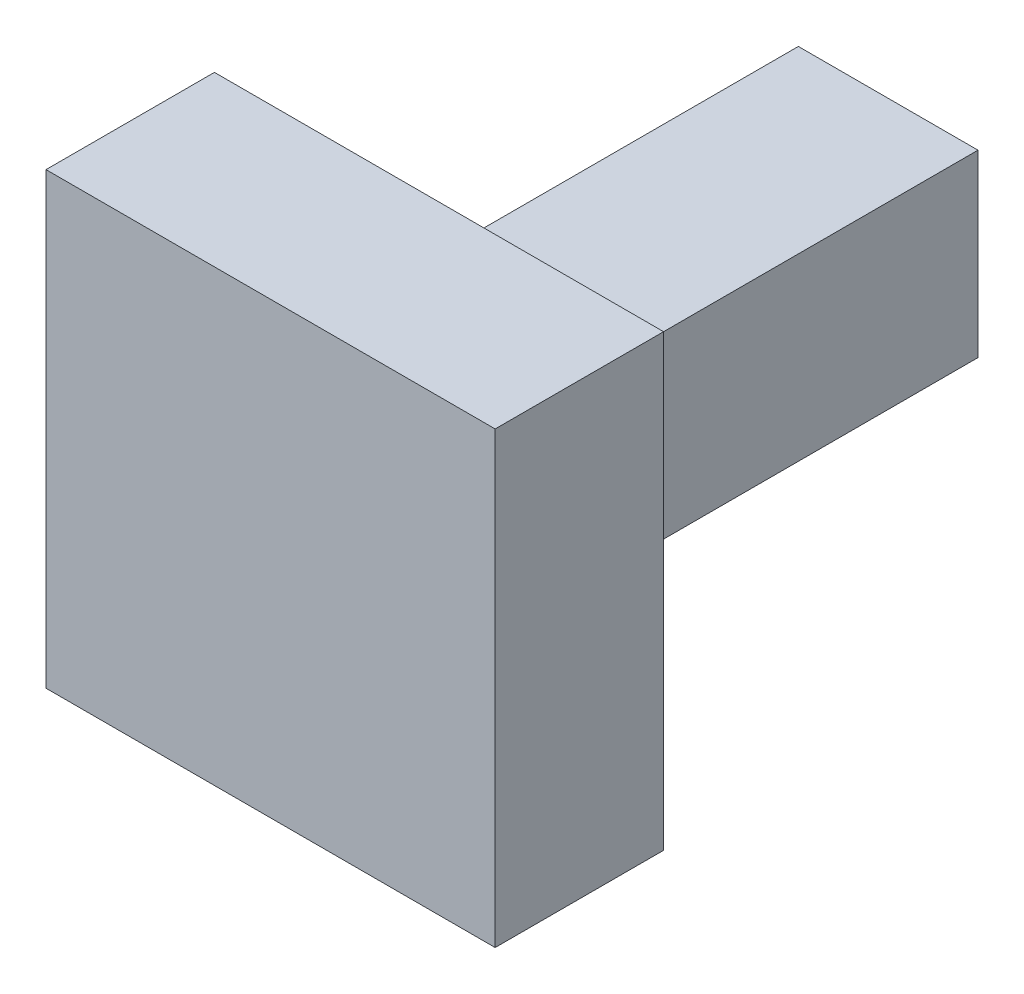
ISO-10303-21;
HEADER;
FILE_DESCRIPTION(('STEP AP214'),'2;1');
FILE_NAME('part.step','',(''),(''),'','','');
FILE_SCHEMA(('AUTOMOTIVE_DESIGN { 1 0 10303 214 1 1 1 1 }'));
ENDSEC;
DATA;
#1=APPLICATION_CONTEXT('core data for automotive mechanical design processes');
#2=APPLICATION_PROTOCOL_DEFINITION('international standard','automotive_design',2000,#1);
#3=PRODUCT_CONTEXT('',#1,'mechanical');
#4=PRODUCT('Part','Part','',(#3));
#5=PRODUCT_RELATED_PRODUCT_CATEGORY('part','',(#4));
#6=PRODUCT_DEFINITION_FORMATION('','',#4);
#7=PRODUCT_DEFINITION_CONTEXT('part definition',#1,'design');
#8=PRODUCT_DEFINITION('design','',#6,#7);
#9=PRODUCT_DEFINITION_SHAPE('','',#8);
#10=(LENGTH_UNIT() NAMED_UNIT(*) SI_UNIT(.MILLI.,.METRE.));
#11=(NAMED_UNIT(*) PLANE_ANGLE_UNIT() SI_UNIT($,.RADIAN.));
#12=(NAMED_UNIT(*) SI_UNIT($,.STERADIAN.) SOLID_ANGLE_UNIT());
#13=UNCERTAINTY_MEASURE_WITH_UNIT(LENGTH_MEASURE(1.E-05),#10,'distance_accuracy_value','');
#14=(GEOMETRIC_REPRESENTATION_CONTEXT(3) GLOBAL_UNCERTAINTY_ASSIGNED_CONTEXT((#13)) GLOBAL_UNIT_ASSIGNED_CONTEXT((#10,
#11,#12)) REPRESENTATION_CONTEXT('',''));
#15=CARTESIAN_POINT('',(0.,0.,0.));
#16=DIRECTION('',(0.,0.,1.));
#17=DIRECTION('',(1.,0.,0.));
#18=AXIS2_PLACEMENT_3D('',#15,#16,#17);
#19=CARTESIAN_POINT('',(0.,0.,15.));
#20=DIRECTION('',(0.,0.,1.));
#21=DIRECTION('',(1.,0.,0.));
#22=AXIS2_PLACEMENT_3D('',#19,#20,#21);
#23=PLANE('',#22);
#24=DIRECTION('',(0.,1.,0.));
#25=VECTOR('',#24,1.);
#26=CARTESIAN_POINT('',(20.,20.,15.));
#27=LINE('',#26,#25);
#28=CARTESIAN_POINT('',(20.,-20.,15.));
#29=VERTEX_POINT('',#28);
#30=CARTESIAN_POINT('',(20.,20.,15.));
#31=VERTEX_POINT('',#30);
#32=EDGE_CURVE('E171',#29,#31,#27,.T.);
#33=ORIENTED_EDGE('',*,*,#32,.T.);
#34=DIRECTION('',(-1.,0.,0.));
#35=VECTOR('',#34,1.);
#36=CARTESIAN_POINT('',(-20.,20.,15.));
#37=LINE('',#36,#35);
#38=CARTESIAN_POINT('',(-20.,20.,15.));
#39=VERTEX_POINT('',#38);
#40=EDGE_CURVE('E88',#31,#39,#37,.T.);
#41=ORIENTED_EDGE('',*,*,#40,.T.);
#42=DIRECTION('',(0.,-1.,0.));
#43=VECTOR('',#42,1.);
#44=CARTESIAN_POINT('',(-20.,20.,15.));
#45=LINE('',#44,#43);
#46=CARTESIAN_POINT('',(-20.,-20.,15.));
#47=VERTEX_POINT('',#46);
#48=EDGE_CURVE('E176',#39,#47,#45,.T.);
#49=ORIENTED_EDGE('',*,*,#48,.T.);
#50=DIRECTION('',(1.,0.,0.));
#51=VECTOR('',#50,1.);
#52=CARTESIAN_POINT('',(-20.,-20.,15.));
#53=LINE('',#52,#51);
#54=EDGE_CURVE('E57',#47,#29,#53,.T.);
#55=ORIENTED_EDGE('',*,*,#54,.T.);
#56=EDGE_LOOP('',(#33,#41,#49,#55));
#57=FACE_BOUND('',#56,.T.);
#58=ADVANCED_FACE('F39',(#57),#23,.T.);
#59=CARTESIAN_POINT('',(0.,0.,0.));
#60=DIRECTION('',(0.,0.,1.));
#61=DIRECTION('',(1.,0.,0.));
#62=AXIS2_PLACEMENT_3D('',#59,#60,#61);
#63=PLANE('',#62);
#64=DIRECTION('',(0.,1.,0.));
#65=VECTOR('',#64,1.);
#66=CARTESIAN_POINT('',(20.,20.,0.));
#67=LINE('',#66,#65);
#68=CARTESIAN_POINT('',(20.,-20.,0.));
#69=VERTEX_POINT('',#68);
#70=CARTESIAN_POINT('',(20.,20.,0.));
#71=VERTEX_POINT('',#70);
#72=EDGE_CURVE('E170',#69,#71,#67,.T.);
#73=ORIENTED_EDGE('',*,*,#72,.F.);
#74=DIRECTION('',(1.,0.,0.));
#75=VECTOR('',#74,1.);
#76=CARTESIAN_POINT('',(-20.,-20.,0.));
#77=LINE('',#76,#75);
#78=CARTESIAN_POINT('',(-20.,-20.,0.));
#79=VERTEX_POINT('',#78);
#80=EDGE_CURVE('E81',#79,#69,#77,.T.);
#81=ORIENTED_EDGE('',*,*,#80,.F.);
#82=DIRECTION('',(0.,-1.,0.));
#83=VECTOR('',#82,1.);
#84=CARTESIAN_POINT('',(-20.,20.,0.));
#85=LINE('',#84,#83);
#86=CARTESIAN_POINT('',(-20.,20.,0.));
#87=VERTEX_POINT('',#86);
#88=EDGE_CURVE('E75',#87,#79,#85,.T.);
#89=ORIENTED_EDGE('',*,*,#88,.F.);
#90=DIRECTION('',(-1.,0.,0.));
#91=VECTOR('',#90,1.);
#92=CARTESIAN_POINT('',(-20.,20.,0.));
#93=LINE('',#92,#91);
#94=EDGE_CURVE('E185',#71,#87,#93,.T.);
#95=ORIENTED_EDGE('',*,*,#94,.F.);
#96=EDGE_LOOP('',(#73,#81,#89,#95));
#97=FACE_BOUND('',#96,.T.);
#98=DIRECTION('',(0.,1.,0.));
#99=VECTOR('',#98,1.);
#100=CARTESIAN_POINT('',(8.,8.,0.));
#101=LINE('',#100,#99);
#102=CARTESIAN_POINT('',(8.,-8.,0.));
#103=VERTEX_POINT('',#102);
#104=CARTESIAN_POINT('',(8.,8.,0.));
#105=VERTEX_POINT('',#104);
#106=EDGE_CURVE('E151',#103,#105,#101,.T.);
#107=ORIENTED_EDGE('',*,*,#106,.T.);
#108=DIRECTION('',(-1.,0.,0.));
#109=VECTOR('',#108,1.);
#110=CARTESIAN_POINT('',(-8.,8.,0.));
#111=LINE('',#110,#109);
#112=CARTESIAN_POINT('',(-8.,8.,0.));
#113=VERTEX_POINT('',#112);
#114=EDGE_CURVE('E161',#105,#113,#111,.T.);
#115=ORIENTED_EDGE('',*,*,#114,.T.);
#116=DIRECTION('',(0.,-1.,0.));
#117=VECTOR('',#116,1.);
#118=CARTESIAN_POINT('',(-8.,8.,0.));
#119=LINE('',#118,#117);
#120=CARTESIAN_POINT('',(-8.,-8.,0.));
#121=VERTEX_POINT('',#120);
#122=EDGE_CURVE('E120',#113,#121,#119,.T.);
#123=ORIENTED_EDGE('',*,*,#122,.T.);
#124=DIRECTION('',(1.,0.,0.));
#125=VECTOR('',#124,1.);
#126=CARTESIAN_POINT('',(-8.,-8.,0.));
#127=LINE('',#126,#125);
#128=EDGE_CURVE('E166',#121,#103,#127,.T.);
#129=ORIENTED_EDGE('',*,*,#128,.T.);
#130=EDGE_LOOP('',(#107,#115,#123,#129));
#131=FACE_BOUND('',#130,.T.);
#132=ADVANCED_FACE('F201',(#97,#131),#63,.F.);
#133=CARTESIAN_POINT('',(20.,20.,15.));
#134=DIRECTION('',(-1.,0.,0.));
#135=DIRECTION('',(0.,0.,1.));
#136=AXIS2_PLACEMENT_3D('',#133,#134,#135);
#137=PLANE('',#136);
#138=ORIENTED_EDGE('',*,*,#72,.T.);
#139=DIRECTION('',(0.,0.,-1.));
#140=VECTOR('',#139,1.);
#141=CARTESIAN_POINT('',(20.,20.,15.));
#142=LINE('',#141,#140);
#143=EDGE_CURVE('E11',#31,#71,#142,.T.);
#144=ORIENTED_EDGE('',*,*,#143,.F.);
#145=ORIENTED_EDGE('',*,*,#32,.F.);
#146=DIRECTION('',(0.,0.,-1.));
#147=VECTOR('',#146,1.);
#148=CARTESIAN_POINT('',(20.,-20.,15.));
#149=LINE('',#148,#147);
#150=EDGE_CURVE('E181',#29,#69,#149,.T.);
#151=ORIENTED_EDGE('',*,*,#150,.T.);
#152=EDGE_LOOP('',(#138,#144,#145,#151));
#153=FACE_BOUND('',#152,.T.);
#154=ADVANCED_FACE('F41',(#153),#137,.F.);
#155=CARTESIAN_POINT('',(-20.,20.,15.));
#156=DIRECTION('',(0.,-1.,0.));
#157=DIRECTION('',(0.,0.,-1.));
#158=AXIS2_PLACEMENT_3D('',#155,#156,#157);
#159=PLANE('',#158);
#160=ORIENTED_EDGE('',*,*,#94,.T.);
#161=DIRECTION('',(0.,0.,-1.));
#162=VECTOR('',#161,1.);
#163=CARTESIAN_POINT('',(-20.,20.,15.));
#164=LINE('',#163,#162);
#165=EDGE_CURVE('E49',#39,#87,#164,.T.);
#166=ORIENTED_EDGE('',*,*,#165,.F.);
#167=ORIENTED_EDGE('',*,*,#40,.F.);
#168=ORIENTED_EDGE('',*,*,#143,.T.);
#169=EDGE_LOOP('',(#160,#166,#167,#168));
#170=FACE_BOUND('',#169,.T.);
#171=ADVANCED_FACE('F215',(#170),#159,.F.);
#172=CARTESIAN_POINT('',(-20.,20.,15.));
#173=DIRECTION('',(1.,0.,0.));
#174=DIRECTION('',(0.,1.,0.));
#175=AXIS2_PLACEMENT_3D('',#172,#173,#174);
#176=PLANE('',#175);
#177=ORIENTED_EDGE('',*,*,#88,.T.);
#178=DIRECTION('',(0.,0.,-1.));
#179=VECTOR('',#178,1.);
#180=CARTESIAN_POINT('',(-20.,-20.,15.));
#181=LINE('',#180,#179);
#182=EDGE_CURVE('E194',#47,#79,#181,.T.);
#183=ORIENTED_EDGE('',*,*,#182,.F.);
#184=ORIENTED_EDGE('',*,*,#48,.F.);
#185=ORIENTED_EDGE('',*,*,#165,.T.);
#186=EDGE_LOOP('',(#177,#183,#184,#185));
#187=FACE_BOUND('',#186,.T.);
#188=ADVANCED_FACE('F198',(#187),#176,.F.);
#189=CARTESIAN_POINT('',(-20.,-20.,15.));
#190=DIRECTION('',(0.,1.,0.));
#191=DIRECTION('',(0.,0.,1.));
#192=AXIS2_PLACEMENT_3D('',#189,#190,#191);
#193=PLANE('',#192);
#194=ORIENTED_EDGE('',*,*,#80,.T.);
#195=ORIENTED_EDGE('',*,*,#150,.F.);
#196=ORIENTED_EDGE('',*,*,#54,.F.);
#197=ORIENTED_EDGE('',*,*,#182,.T.);
#198=EDGE_LOOP('',(#194,#195,#196,#197));
#199=FACE_BOUND('',#198,.T.);
#200=ADVANCED_FACE('F206',(#199),#193,.F.);
#201=CARTESIAN_POINT('',(8.,8.,-40.));
#202=DIRECTION('',(0.,1.,0.));
#203=DIRECTION('',(0.,0.,1.));
#204=AXIS2_PLACEMENT_3D('',#201,#202,#203);
#205=PLANE('',#204);
#206=ORIENTED_EDGE('',*,*,#114,.F.);
#207=DIRECTION('',(0.,0.,1.));
#208=VECTOR('',#207,1.);
#209=CARTESIAN_POINT('',(8.,8.,-40.));
#210=LINE('',#209,#208);
#211=CARTESIAN_POINT('',(8.,8.,-40.));
#212=VERTEX_POINT('',#211);
#213=EDGE_CURVE('E141',#212,#105,#210,.T.);
#214=ORIENTED_EDGE('',*,*,#213,.F.);
#215=DIRECTION('',(-1.,0.,0.));
#216=VECTOR('',#215,1.);
#217=CARTESIAN_POINT('',(8.,8.,-40.));
#218=LINE('',#217,#216);
#219=CARTESIAN_POINT('',(-8.,8.,-40.));
#220=VERTEX_POINT('',#219);
#221=EDGE_CURVE('E133',#212,#220,#218,.T.);
#222=ORIENTED_EDGE('',*,*,#221,.T.);
#223=DIRECTION('',(0.,0.,1.));
#224=VECTOR('',#223,1.);
#225=CARTESIAN_POINT('',(-8.,8.,-40.));
#226=LINE('',#225,#224);
#227=EDGE_CURVE('E115',#220,#113,#226,.T.);
#228=ORIENTED_EDGE('',*,*,#227,.T.);
#229=EDGE_LOOP('',(#206,#214,#222,#228));
#230=FACE_BOUND('',#229,.T.);
#231=ADVANCED_FACE('F139',(#230),#205,.T.);
#232=CARTESIAN_POINT('',(-8.,-8.,-40.));
#233=DIRECTION('',(0.,-1.,0.));
#234=DIRECTION('',(0.,0.,-1.));
#235=AXIS2_PLACEMENT_3D('',#232,#233,#234);
#236=PLANE('',#235);
#237=ORIENTED_EDGE('',*,*,#128,.F.);
#238=DIRECTION('',(0.,0.,1.));
#239=VECTOR('',#238,1.);
#240=CARTESIAN_POINT('',(-8.,-8.,-40.));
#241=LINE('',#240,#239);
#242=CARTESIAN_POINT('',(-8.,-8.,-40.));
#243=VERTEX_POINT('',#242);
#244=EDGE_CURVE('E125',#243,#121,#241,.T.);
#245=ORIENTED_EDGE('',*,*,#244,.F.);
#246=DIRECTION('',(1.,0.,0.));
#247=VECTOR('',#246,1.);
#248=CARTESIAN_POINT('',(-8.,-8.,-40.));
#249=LINE('',#248,#247);
#250=CARTESIAN_POINT('',(8.,-8.,-40.));
#251=VERTEX_POINT('',#250);
#252=EDGE_CURVE('E136',#243,#251,#249,.T.);
#253=ORIENTED_EDGE('',*,*,#252,.T.);
#254=DIRECTION('',(0.,0.,1.));
#255=VECTOR('',#254,1.);
#256=CARTESIAN_POINT('',(8.,-8.,-40.));
#257=LINE('',#256,#255);
#258=EDGE_CURVE('E152',#251,#103,#257,.T.);
#259=ORIENTED_EDGE('',*,*,#258,.T.);
#260=EDGE_LOOP('',(#237,#245,#253,#259));
#261=FACE_BOUND('',#260,.T.);
#262=ADVANCED_FACE('F213',(#261),#236,.T.);
#263=CARTESIAN_POINT('',(8.,-8.,-40.));
#264=DIRECTION('',(1.,0.,0.));
#265=DIRECTION('',(0.,1.,0.));
#266=AXIS2_PLACEMENT_3D('',#263,#264,#265);
#267=PLANE('',#266);
#268=ORIENTED_EDGE('',*,*,#106,.F.);
#269=ORIENTED_EDGE('',*,*,#258,.F.);
#270=DIRECTION('',(0.,1.,0.));
#271=VECTOR('',#270,1.);
#272=CARTESIAN_POINT('',(8.,-8.,-40.));
#273=LINE('',#272,#271);
#274=EDGE_CURVE('E126',#251,#212,#273,.T.);
#275=ORIENTED_EDGE('',*,*,#274,.T.);
#276=ORIENTED_EDGE('',*,*,#213,.T.);
#277=EDGE_LOOP('',(#268,#269,#275,#276));
#278=FACE_BOUND('',#277,.T.);
#279=ADVANCED_FACE('F226',(#278),#267,.T.);
#280=CARTESIAN_POINT('',(-8.,8.,-40.));
#281=DIRECTION('',(-1.,0.,0.));
#282=DIRECTION('',(0.,-1.,0.));
#283=AXIS2_PLACEMENT_3D('',#280,#281,#282);
#284=PLANE('',#283);
#285=ORIENTED_EDGE('',*,*,#122,.F.);
#286=ORIENTED_EDGE('',*,*,#227,.F.);
#287=DIRECTION('',(0.,-1.,0.));
#288=VECTOR('',#287,1.);
#289=CARTESIAN_POINT('',(-8.,8.,-40.));
#290=LINE('',#289,#288);
#291=EDGE_CURVE('E118',#220,#243,#290,.T.);
#292=ORIENTED_EDGE('',*,*,#291,.T.);
#293=ORIENTED_EDGE('',*,*,#244,.T.);
#294=EDGE_LOOP('',(#285,#286,#292,#293));
#295=FACE_BOUND('',#294,.T.);
#296=ADVANCED_FACE('F117',(#295),#284,.T.);
#297=CARTESIAN_POINT('',(0.,0.,-40.));
#298=DIRECTION('',(0.,0.,1.));
#299=DIRECTION('',(1.,0.,0.));
#300=AXIS2_PLACEMENT_3D('',#297,#298,#299);
#301=PLANE('',#300);
#302=ORIENTED_EDGE('',*,*,#221,.F.);
#303=ORIENTED_EDGE('',*,*,#274,.F.);
#304=ORIENTED_EDGE('',*,*,#252,.F.);
#305=ORIENTED_EDGE('',*,*,#291,.F.);
#306=EDGE_LOOP('',(#302,#303,#304,#305));
#307=FACE_BOUND('',#306,.T.);
#308=ADVANCED_FACE('F131',(#307),#301,.F.);
#309=CLOSED_SHELL('',(#58,#132,#154,#171,#188,#200,#231,#262,#279,#296,#308));
#310=MANIFOLD_SOLID_BREP('B2',#309);
#311=ADVANCED_BREP_SHAPE_REPRESENTATION('',(#18,#310),#14);
#312=SHAPE_DEFINITION_REPRESENTATION(#9,#311);
ENDSEC;
END-ISO-10303-21;
